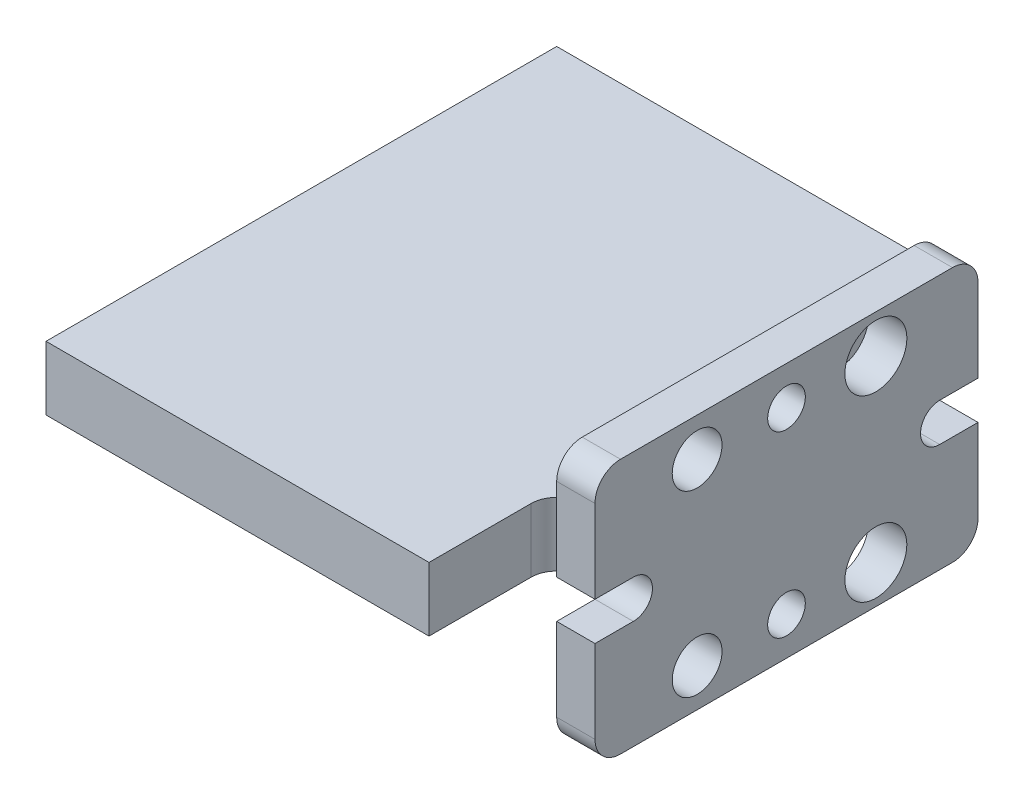
ISO-10303-21;
HEADER;
FILE_DESCRIPTION(('STEP AP214'),'2;1');
FILE_NAME('part.step','',(''),(''),'','','');
FILE_SCHEMA(('AUTOMOTIVE_DESIGN { 1 0 10303 214 1 1 1 1 }'));
ENDSEC;
DATA;
#1=APPLICATION_CONTEXT('core data for automotive mechanical design processes');
#2=APPLICATION_PROTOCOL_DEFINITION('international standard','automotive_design',2000,#1);
#3=PRODUCT_CONTEXT('',#1,'mechanical');
#4=PRODUCT('Part','Part','',(#3));
#5=PRODUCT_RELATED_PRODUCT_CATEGORY('part','',(#4));
#6=PRODUCT_DEFINITION_FORMATION('','',#4);
#7=PRODUCT_DEFINITION_CONTEXT('part definition',#1,'design');
#8=PRODUCT_DEFINITION('design','',#6,#7);
#9=PRODUCT_DEFINITION_SHAPE('','',#8);
#10=(LENGTH_UNIT() NAMED_UNIT(*) SI_UNIT(.MILLI.,.METRE.));
#11=(NAMED_UNIT(*) PLANE_ANGLE_UNIT() SI_UNIT($,.RADIAN.));
#12=(NAMED_UNIT(*) SI_UNIT($,.STERADIAN.) SOLID_ANGLE_UNIT());
#13=UNCERTAINTY_MEASURE_WITH_UNIT(LENGTH_MEASURE(1.E-05),#10,'distance_accuracy_value','');
#14=(GEOMETRIC_REPRESENTATION_CONTEXT(3) GLOBAL_UNCERTAINTY_ASSIGNED_CONTEXT((#13)) GLOBAL_UNIT_ASSIGNED_CONTEXT((#10,
#11,#12)) REPRESENTATION_CONTEXT('',''));
#15=CARTESIAN_POINT('',(0.,0.,0.));
#16=DIRECTION('',(0.,0.,1.));
#17=DIRECTION('',(1.,0.,0.));
#18=AXIS2_PLACEMENT_3D('',#15,#16,#17);
#19=CARTESIAN_POINT('',(3.,0.,0.));
#20=DIRECTION('',(1.,0.,0.));
#21=DIRECTION('',(0.,0.,-1.));
#22=AXIS2_PLACEMENT_3D('',#19,#20,#21);
#23=PLANE('',#22);
#24=CARTESIAN_POINT('',(3.,-7.,7.));
#25=DIRECTION('',(1.,0.,0.));
#26=DIRECTION('',(0.,0.,-1.));
#27=AXIS2_PLACEMENT_3D('',#24,#25,#26);
#28=CIRCLE('',#27,1.95);
#29=CARTESIAN_POINT('',(3.,-7.,5.05));
#30=VERTEX_POINT('',#29);
#31=EDGE_CURVE('E807',#30,#30,#28,.T.);
#32=ORIENTED_EDGE('',*,*,#31,.F.);
#33=EDGE_LOOP('',(#32));
#34=FACE_BOUND('',#33,.T.);
#35=CARTESIAN_POINT('',(3.,-7.,-7.));
#36=DIRECTION('',(1.,0.,0.));
#37=DIRECTION('',(0.,0.,-1.));
#38=AXIS2_PLACEMENT_3D('',#35,#36,#37);
#39=CIRCLE('',#38,2.425);
#40=CARTESIAN_POINT('',(3.,-7.,-9.425));
#41=VERTEX_POINT('',#40);
#42=EDGE_CURVE('E811',#41,#41,#39,.T.);
#43=ORIENTED_EDGE('',*,*,#42,.F.);
#44=EDGE_LOOP('',(#43));
#45=FACE_BOUND('',#44,.T.);
#46=CARTESIAN_POINT('',(3.,7.,-7.));
#47=DIRECTION('',(1.,0.,0.));
#48=DIRECTION('',(0.,0.,1.));
#49=AXIS2_PLACEMENT_3D('',#46,#47,#48);
#50=CIRCLE('',#49,2.425);
#51=CARTESIAN_POINT('',(3.,7.,-4.575));
#52=VERTEX_POINT('',#51);
#53=EDGE_CURVE('E821',#52,#52,#50,.T.);
#54=ORIENTED_EDGE('',*,*,#53,.F.);
#55=EDGE_LOOP('',(#54));
#56=FACE_BOUND('',#55,.T.);
#57=CARTESIAN_POINT('',(3.,7.,0.));
#58=DIRECTION('',(1.,0.,0.));
#59=DIRECTION('',(0.,0.,1.));
#60=AXIS2_PLACEMENT_3D('',#57,#58,#59);
#61=CIRCLE('',#60,1.475);
#62=CARTESIAN_POINT('',(3.,7.,1.475));
#63=VERTEX_POINT('',#62);
#64=EDGE_CURVE('E827',#63,#63,#61,.T.);
#65=ORIENTED_EDGE('',*,*,#64,.F.);
#66=EDGE_LOOP('',(#65));
#67=FACE_BOUND('',#66,.T.);
#68=CARTESIAN_POINT('',(3.,7.,7.));
#69=DIRECTION('',(1.,0.,0.));
#70=DIRECTION('',(0.,0.,1.));
#71=AXIS2_PLACEMENT_3D('',#68,#69,#70);
#72=CIRCLE('',#71,1.95);
#73=CARTESIAN_POINT('',(3.,7.,8.95));
#74=VERTEX_POINT('',#73);
#75=EDGE_CURVE('E833',#74,#74,#72,.T.);
#76=ORIENTED_EDGE('',*,*,#75,.F.);
#77=EDGE_LOOP('',(#76));
#78=FACE_BOUND('',#77,.T.);
#79=CARTESIAN_POINT('',(3.,-7.,0.));
#80=DIRECTION('',(1.,0.,0.));
#81=DIRECTION('',(0.,0.,-1.));
#82=AXIS2_PLACEMENT_3D('',#79,#80,#81);
#83=CIRCLE('',#82,1.475);
#84=CARTESIAN_POINT('',(3.,-7.,-1.475));
#85=VERTEX_POINT('',#84);
#86=EDGE_CURVE('E239',#85,#85,#83,.T.);
#87=ORIENTED_EDGE('',*,*,#86,.F.);
#88=EDGE_LOOP('',(#87));
#89=FACE_BOUND('',#88,.T.);
#90=DIRECTION('',(0.,1.,0.));
#91=VECTOR('',#90,1.);
#92=CARTESIAN_POINT('',(3.,10.,-15.));
#93=LINE('',#92,#91);
#94=CARTESIAN_POINT('',(3.,-8.,-15.));
#95=VERTEX_POINT('',#94);
#96=CARTESIAN_POINT('',(3.,-1.5,-15.));
#97=VERTEX_POINT('',#96);
#98=EDGE_CURVE('E231',#95,#97,#93,.T.);
#99=ORIENTED_EDGE('',*,*,#98,.T.);
#100=DIRECTION('',(0.,0.,-1.));
#101=VECTOR('',#100,1.);
#102=CARTESIAN_POINT('',(3.,-1.5,-12.));
#103=LINE('',#102,#101);
#104=CARTESIAN_POINT('',(3.,-1.5,-12.));
#105=VERTEX_POINT('',#104);
#106=EDGE_CURVE('E219',#105,#97,#103,.T.);
#107=ORIENTED_EDGE('',*,*,#106,.F.);
#108=CARTESIAN_POINT('',(3.,0.,-12.));
#109=DIRECTION('',(1.,0.,0.));
#110=DIRECTION('',(0.,0.,1.));
#111=AXIS2_PLACEMENT_3D('',#108,#109,#110);
#112=CIRCLE('',#111,1.5);
#113=CARTESIAN_POINT('',(3.,1.5,-12.));
#114=VERTEX_POINT('',#113);
#115=EDGE_CURVE('E209',#114,#105,#112,.T.);
#116=ORIENTED_EDGE('',*,*,#115,.F.);
#117=DIRECTION('',(0.,0.,1.));
#118=VECTOR('',#117,1.);
#119=CARTESIAN_POINT('',(3.,1.5,-12.));
#120=LINE('',#119,#118);
#121=CARTESIAN_POINT('',(3.,1.5,-15.));
#122=VERTEX_POINT('',#121);
#123=EDGE_CURVE('E232',#122,#114,#120,.T.);
#124=ORIENTED_EDGE('',*,*,#123,.F.);
#125=CARTESIAN_POINT('',(3.,8.,-15.));
#126=VERTEX_POINT('',#125);
#127=EDGE_CURVE('E300',#122,#126,#93,.T.);
#128=ORIENTED_EDGE('',*,*,#127,.T.);
#129=CARTESIAN_POINT('',(3.,8.,-13.));
#130=DIRECTION('',(1.,0.,0.));
#131=DIRECTION('',(0.,0.,-1.));
#132=AXIS2_PLACEMENT_3D('',#129,#130,#131);
#133=CIRCLE('',#132,2.);
#134=CARTESIAN_POINT('',(3.,10.,-13.));
#135=VERTEX_POINT('',#134);
#136=EDGE_CURVE('E354',#126,#135,#133,.T.);
#137=ORIENTED_EDGE('',*,*,#136,.T.);
#138=DIRECTION('',(0.,0.,1.));
#139=VECTOR('',#138,1.);
#140=CARTESIAN_POINT('',(3.,10.,15.));
#141=LINE('',#140,#139);
#142=CARTESIAN_POINT('',(3.,10.,13.));
#143=VERTEX_POINT('',#142);
#144=EDGE_CURVE('E299',#135,#143,#141,.T.);
#145=ORIENTED_EDGE('',*,*,#144,.T.);
#146=CARTESIAN_POINT('',(3.,8.,13.));
#147=DIRECTION('',(1.,0.,0.));
#148=DIRECTION('',(0.,0.,-1.));
#149=AXIS2_PLACEMENT_3D('',#146,#147,#148);
#150=CIRCLE('',#149,2.);
#151=CARTESIAN_POINT('',(3.,8.,15.));
#152=VERTEX_POINT('',#151);
#153=EDGE_CURVE('E362',#143,#152,#150,.T.);
#154=ORIENTED_EDGE('',*,*,#153,.T.);
#155=DIRECTION('',(0.,-1.,0.));
#156=VECTOR('',#155,1.);
#157=CARTESIAN_POINT('',(3.,10.,15.));
#158=LINE('',#157,#156);
#159=CARTESIAN_POINT('',(3.,1.5,15.));
#160=VERTEX_POINT('',#159);
#161=EDGE_CURVE('E304',#152,#160,#158,.T.);
#162=ORIENTED_EDGE('',*,*,#161,.T.);
#163=DIRECTION('',(0.,0.,1.));
#164=VECTOR('',#163,1.);
#165=CARTESIAN_POINT('',(3.,1.5,12.));
#166=LINE('',#165,#164);
#167=CARTESIAN_POINT('',(3.,1.5,12.));
#168=VERTEX_POINT('',#167);
#169=EDGE_CURVE('E251',#168,#160,#166,.T.);
#170=ORIENTED_EDGE('',*,*,#169,.F.);
#171=CARTESIAN_POINT('',(3.,0.,12.));
#172=DIRECTION('',(1.,0.,0.));
#173=DIRECTION('',(0.,0.,-1.));
#174=AXIS2_PLACEMENT_3D('',#171,#172,#173);
#175=CIRCLE('',#174,1.5);
#176=CARTESIAN_POINT('',(3.,-1.5,12.));
#177=VERTEX_POINT('',#176);
#178=EDGE_CURVE('E248',#177,#168,#175,.T.);
#179=ORIENTED_EDGE('',*,*,#178,.F.);
#180=DIRECTION('',(0.,0.,-1.));
#181=VECTOR('',#180,1.);
#182=CARTESIAN_POINT('',(3.,-1.5,12.));
#183=LINE('',#182,#181);
#184=CARTESIAN_POINT('',(3.,-1.5,15.));
#185=VERTEX_POINT('',#184);
#186=EDGE_CURVE('E246',#185,#177,#183,.T.);
#187=ORIENTED_EDGE('',*,*,#186,.F.);
#188=CARTESIAN_POINT('',(3.,-8.,15.));
#189=VERTEX_POINT('',#188);
#190=EDGE_CURVE('E303',#185,#189,#158,.T.);
#191=ORIENTED_EDGE('',*,*,#190,.T.);
#192=CARTESIAN_POINT('',(3.,-8.,13.));
#193=DIRECTION('',(1.,0.,0.));
#194=DIRECTION('',(0.,0.,-1.));
#195=AXIS2_PLACEMENT_3D('',#192,#193,#194);
#196=CIRCLE('',#195,2.);
#197=CARTESIAN_POINT('',(3.,-10.,13.));
#198=VERTEX_POINT('',#197);
#199=EDGE_CURVE('E386',#189,#198,#196,.T.);
#200=ORIENTED_EDGE('',*,*,#199,.T.);
#201=DIRECTION('',(0.,0.,-1.));
#202=VECTOR('',#201,1.);
#203=CARTESIAN_POINT('',(3.,-10.,15.));
#204=LINE('',#203,#202);
#205=CARTESIAN_POINT('',(3.,-10.,-13.));
#206=VERTEX_POINT('',#205);
#207=EDGE_CURVE('E307',#198,#206,#204,.T.);
#208=ORIENTED_EDGE('',*,*,#207,.T.);
#209=CARTESIAN_POINT('',(3.,-8.,-13.));
#210=DIRECTION('',(1.,0.,0.));
#211=DIRECTION('',(0.,0.,-1.));
#212=AXIS2_PLACEMENT_3D('',#209,#210,#211);
#213=CIRCLE('',#212,2.);
#214=EDGE_CURVE('E375',#206,#95,#213,.T.);
#215=ORIENTED_EDGE('',*,*,#214,.T.);
#216=EDGE_LOOP('',(#99,#107,#116,#124,#128,#137,#145,#154,#162,#170,#179,#187,#191,#200,#208,#215));
#217=FACE_BOUND('',#216,.T.);
#218=ADVANCED_FACE('F35',(#34,#45,#56,#67,#78,#89,#217),#23,.T.);
#219=CARTESIAN_POINT('',(0.,0.,0.));
#220=DIRECTION('',(1.,0.,0.));
#221=DIRECTION('',(0.,0.,-1.));
#222=AXIS2_PLACEMENT_3D('',#219,#220,#221);
#223=PLANE('',#222);
#224=CARTESIAN_POINT('',(0.,-7.,7.));
#225=DIRECTION('',(1.,0.,0.));
#226=DIRECTION('',(0.,0.,-1.));
#227=AXIS2_PLACEMENT_3D('',#224,#225,#226);
#228=CIRCLE('',#227,1.95);
#229=CARTESIAN_POINT('',(0.,-7.,5.05));
#230=VERTEX_POINT('',#229);
#231=EDGE_CURVE('E810',#230,#230,#228,.T.);
#232=ORIENTED_EDGE('',*,*,#231,.T.);
#233=EDGE_LOOP('',(#232));
#234=FACE_BOUND('',#233,.T.);
#235=CARTESIAN_POINT('',(0.,-7.,-7.));
#236=DIRECTION('',(1.,0.,0.));
#237=DIRECTION('',(0.,0.,-1.));
#238=AXIS2_PLACEMENT_3D('',#235,#236,#237);
#239=CIRCLE('',#238,2.425);
#240=CARTESIAN_POINT('',(0.,-7.,-9.425));
#241=VERTEX_POINT('',#240);
#242=EDGE_CURVE('E816',#241,#241,#239,.T.);
#243=ORIENTED_EDGE('',*,*,#242,.T.);
#244=EDGE_LOOP('',(#243));
#245=FACE_BOUND('',#244,.T.);
#246=CARTESIAN_POINT('',(0.,7.,-7.));
#247=DIRECTION('',(1.,0.,0.));
#248=DIRECTION('',(0.,0.,1.));
#249=AXIS2_PLACEMENT_3D('',#246,#247,#248);
#250=CIRCLE('',#249,2.425);
#251=CARTESIAN_POINT('',(0.,7.,-4.575));
#252=VERTEX_POINT('',#251);
#253=EDGE_CURVE('E824',#252,#252,#250,.T.);
#254=ORIENTED_EDGE('',*,*,#253,.T.);
#255=EDGE_LOOP('',(#254));
#256=FACE_BOUND('',#255,.T.);
#257=CARTESIAN_POINT('',(0.,7.,0.));
#258=DIRECTION('',(1.,0.,0.));
#259=DIRECTION('',(0.,0.,1.));
#260=AXIS2_PLACEMENT_3D('',#257,#258,#259);
#261=CIRCLE('',#260,1.475);
#262=CARTESIAN_POINT('',(0.,7.,1.475));
#263=VERTEX_POINT('',#262);
#264=EDGE_CURVE('E830',#263,#263,#261,.T.);
#265=ORIENTED_EDGE('',*,*,#264,.T.);
#266=EDGE_LOOP('',(#265));
#267=FACE_BOUND('',#266,.T.);
#268=CARTESIAN_POINT('',(0.,7.,7.));
#269=DIRECTION('',(1.,0.,0.));
#270=DIRECTION('',(0.,0.,1.));
#271=AXIS2_PLACEMENT_3D('',#268,#269,#270);
#272=CIRCLE('',#271,1.95);
#273=CARTESIAN_POINT('',(0.,7.,8.95));
#274=VERTEX_POINT('',#273);
#275=EDGE_CURVE('E836',#274,#274,#272,.T.);
#276=ORIENTED_EDGE('',*,*,#275,.T.);
#277=EDGE_LOOP('',(#276));
#278=FACE_BOUND('',#277,.T.);
#279=CARTESIAN_POINT('',(0.,-7.,0.));
#280=DIRECTION('',(1.,0.,0.));
#281=DIRECTION('',(0.,0.,-1.));
#282=AXIS2_PLACEMENT_3D('',#279,#280,#281);
#283=CIRCLE('',#282,1.475);
#284=CARTESIAN_POINT('',(0.,-7.,-1.475));
#285=VERTEX_POINT('',#284);
#286=EDGE_CURVE('E813',#285,#285,#283,.T.);
#287=ORIENTED_EDGE('',*,*,#286,.T.);
#288=EDGE_LOOP('',(#287));
#289=FACE_BOUND('',#288,.T.);
#290=DIRECTION('',(0.,1.,0.));
#291=VECTOR('',#290,1.);
#292=CARTESIAN_POINT('',(0.,2.5,-10.));
#293=LINE('',#292,#291);
#294=CARTESIAN_POINT('',(0.,-2.5,-10.));
#295=VERTEX_POINT('',#294);
#296=CARTESIAN_POINT('',(0.,2.5,-10.));
#297=VERTEX_POINT('',#296);
#298=EDGE_CURVE('E309',#295,#297,#293,.T.);
#299=ORIENTED_EDGE('',*,*,#298,.T.);
#300=DIRECTION('',(0.,0.,1.));
#301=VECTOR('',#300,1.);
#302=CARTESIAN_POINT('',(0.,2.5,10.));
#303=LINE('',#302,#301);
#304=CARTESIAN_POINT('',(0.,2.5,10.));
#305=VERTEX_POINT('',#304);
#306=EDGE_CURVE('E330',#297,#305,#303,.T.);
#307=ORIENTED_EDGE('',*,*,#306,.T.);
#308=DIRECTION('',(0.,-1.,0.));
#309=VECTOR('',#308,1.);
#310=CARTESIAN_POINT('',(0.,2.5,10.));
#311=LINE('',#310,#309);
#312=CARTESIAN_POINT('',(0.,-2.5,10.));
#313=VERTEX_POINT('',#312);
#314=EDGE_CURVE('E333',#305,#313,#311,.T.);
#315=ORIENTED_EDGE('',*,*,#314,.T.);
#316=DIRECTION('',(0.,0.,-1.));
#317=VECTOR('',#316,1.);
#318=CARTESIAN_POINT('',(0.,-2.5,10.));
#319=LINE('',#318,#317);
#320=EDGE_CURVE('E325',#313,#295,#319,.T.);
#321=ORIENTED_EDGE('',*,*,#320,.T.);
#322=EDGE_LOOP('',(#299,#307,#315,#321));
#323=FACE_BOUND('',#322,.T.);
#324=DIRECTION('',(0.,0.,-1.));
#325=VECTOR('',#324,1.);
#326=CARTESIAN_POINT('',(0.,-1.5,-12.));
#327=LINE('',#326,#325);
#328=CARTESIAN_POINT('',(0.,-1.5,-12.));
#329=VERTEX_POINT('',#328);
#330=CARTESIAN_POINT('',(0.,-1.5,-15.));
#331=VERTEX_POINT('',#330);
#332=EDGE_CURVE('E225',#329,#331,#327,.T.);
#333=ORIENTED_EDGE('',*,*,#332,.T.);
#334=DIRECTION('',(0.,1.,0.));
#335=VECTOR('',#334,1.);
#336=CARTESIAN_POINT('',(0.,10.,-15.));
#337=LINE('',#336,#335);
#338=CARTESIAN_POINT('',(0.,-8.,-15.));
#339=VERTEX_POINT('',#338);
#340=EDGE_CURVE('E310',#339,#331,#337,.T.);
#341=ORIENTED_EDGE('',*,*,#340,.F.);
#342=CARTESIAN_POINT('',(0.,-8.,-13.));
#343=DIRECTION('',(1.,0.,0.));
#344=DIRECTION('',(0.,0.,-1.));
#345=AXIS2_PLACEMENT_3D('',#342,#343,#344);
#346=CIRCLE('',#345,2.);
#347=CARTESIAN_POINT('',(0.,-10.,-13.));
#348=VERTEX_POINT('',#347);
#349=EDGE_CURVE('E372',#339,#348,#346,.F.);
#350=ORIENTED_EDGE('',*,*,#349,.T.);
#351=DIRECTION('',(0.,0.,-1.));
#352=VECTOR('',#351,1.);
#353=CARTESIAN_POINT('',(0.,-10.,15.));
#354=LINE('',#353,#352);
#355=CARTESIAN_POINT('',(0.,-10.,13.));
#356=VERTEX_POINT('',#355);
#357=EDGE_CURVE('E320',#356,#348,#354,.T.);
#358=ORIENTED_EDGE('',*,*,#357,.F.);
#359=CARTESIAN_POINT('',(0.,-8.,13.));
#360=DIRECTION('',(1.,0.,0.));
#361=DIRECTION('',(0.,0.,-1.));
#362=AXIS2_PLACEMENT_3D('',#359,#360,#361);
#363=CIRCLE('',#362,2.);
#364=CARTESIAN_POINT('',(0.,-8.,15.));
#365=VERTEX_POINT('',#364);
#366=EDGE_CURVE('E383',#356,#365,#363,.F.);
#367=ORIENTED_EDGE('',*,*,#366,.T.);
#368=DIRECTION('',(0.,-1.,0.));
#369=VECTOR('',#368,1.);
#370=CARTESIAN_POINT('',(0.,10.,15.));
#371=LINE('',#370,#369);
#372=CARTESIAN_POINT('',(0.,-1.5,15.));
#373=VERTEX_POINT('',#372);
#374=EDGE_CURVE('E316',#373,#365,#371,.T.);
#375=ORIENTED_EDGE('',*,*,#374,.F.);
#376=DIRECTION('',(0.,0.,-1.));
#377=VECTOR('',#376,1.);
#378=CARTESIAN_POINT('',(0.,-1.5,12.));
#379=LINE('',#378,#377);
#380=CARTESIAN_POINT('',(0.,-1.5,12.));
#381=VERTEX_POINT('',#380);
#382=EDGE_CURVE('E226',#373,#381,#379,.T.);
#383=ORIENTED_EDGE('',*,*,#382,.T.);
#384=CARTESIAN_POINT('',(0.,0.,12.));
#385=DIRECTION('',(1.,0.,0.));
#386=DIRECTION('',(0.,0.,-1.));
#387=AXIS2_PLACEMENT_3D('',#384,#385,#386);
#388=CIRCLE('',#387,1.5);
#389=CARTESIAN_POINT('',(0.,1.5,12.));
#390=VERTEX_POINT('',#389);
#391=EDGE_CURVE('E255',#381,#390,#388,.T.);
#392=ORIENTED_EDGE('',*,*,#391,.T.);
#393=DIRECTION('',(0.,0.,1.));
#394=VECTOR('',#393,1.);
#395=CARTESIAN_POINT('',(0.,1.5,12.));
#396=LINE('',#395,#394);
#397=CARTESIAN_POINT('',(0.,1.5,15.));
#398=VERTEX_POINT('',#397);
#399=EDGE_CURVE('E249',#390,#398,#396,.T.);
#400=ORIENTED_EDGE('',*,*,#399,.T.);
#401=CARTESIAN_POINT('',(0.,8.,15.));
#402=VERTEX_POINT('',#401);
#403=EDGE_CURVE('E317',#402,#398,#371,.T.);
#404=ORIENTED_EDGE('',*,*,#403,.F.);
#405=CARTESIAN_POINT('',(0.,8.,13.));
#406=DIRECTION('',(1.,0.,0.));
#407=DIRECTION('',(0.,0.,-1.));
#408=AXIS2_PLACEMENT_3D('',#405,#406,#407);
#409=CIRCLE('',#408,2.);
#410=CARTESIAN_POINT('',(0.,10.,13.));
#411=VERTEX_POINT('',#410);
#412=EDGE_CURVE('E364',#402,#411,#409,.F.);
#413=ORIENTED_EDGE('',*,*,#412,.T.);
#414=DIRECTION('',(0.,0.,1.));
#415=VECTOR('',#414,1.);
#416=CARTESIAN_POINT('',(0.,10.,15.));
#417=LINE('',#416,#415);
#418=CARTESIAN_POINT('',(0.,10.,-13.));
#419=VERTEX_POINT('',#418);
#420=EDGE_CURVE('E313',#419,#411,#417,.T.);
#421=ORIENTED_EDGE('',*,*,#420,.F.);
#422=CARTESIAN_POINT('',(0.,8.,-13.));
#423=DIRECTION('',(1.,0.,0.));
#424=DIRECTION('',(0.,0.,-1.));
#425=AXIS2_PLACEMENT_3D('',#422,#423,#424);
#426=CIRCLE('',#425,2.);
#427=CARTESIAN_POINT('',(0.,8.,-15.));
#428=VERTEX_POINT('',#427);
#429=EDGE_CURVE('E351',#419,#428,#426,.F.);
#430=ORIENTED_EDGE('',*,*,#429,.T.);
#431=CARTESIAN_POINT('',(0.,1.5,-15.));
#432=VERTEX_POINT('',#431);
#433=EDGE_CURVE('E297',#432,#428,#337,.T.);
#434=ORIENTED_EDGE('',*,*,#433,.F.);
#435=DIRECTION('',(0.,0.,1.));
#436=VECTOR('',#435,1.);
#437=CARTESIAN_POINT('',(0.,1.5,-12.));
#438=LINE('',#437,#436);
#439=CARTESIAN_POINT('',(0.,1.5,-12.));
#440=VERTEX_POINT('',#439);
#441=EDGE_CURVE('E50',#432,#440,#438,.T.);
#442=ORIENTED_EDGE('',*,*,#441,.T.);
#443=CARTESIAN_POINT('',(0.,0.,-12.));
#444=DIRECTION('',(1.,0.,0.));
#445=DIRECTION('',(0.,0.,1.));
#446=AXIS2_PLACEMENT_3D('',#443,#444,#445);
#447=CIRCLE('',#446,1.5);
#448=EDGE_CURVE('E237',#440,#329,#447,.T.);
#449=ORIENTED_EDGE('',*,*,#448,.T.);
#450=EDGE_LOOP('',(#333,#341,#350,#358,#367,#375,#383,#392,#400,#404,#413,#421,#430,#434,#442,#449));
#451=FACE_BOUND('',#450,.T.);
#452=ADVANCED_FACE('F430',(#234,#245,#256,#267,#278,#289,#323,#451),#223,.F.);
#453=CARTESIAN_POINT('',(3.,10.,-15.));
#454=DIRECTION('',(0.,0.,1.));
#455=DIRECTION('',(1.,0.,0.));
#456=AXIS2_PLACEMENT_3D('',#453,#454,#455);
#457=PLANE('',#456);
#458=DIRECTION('',(-1.,0.,0.));
#459=VECTOR('',#458,1.);
#460=CARTESIAN_POINT('',(3.,-1.5,-15.));
#461=LINE('',#460,#459);
#462=EDGE_CURVE('E227',#97,#331,#461,.T.);
#463=ORIENTED_EDGE('',*,*,#462,.F.);
#464=ORIENTED_EDGE('',*,*,#98,.F.);
#465=DIRECTION('',(1.,0.,0.));
#466=VECTOR('',#465,1.);
#467=CARTESIAN_POINT('',(3.,-8.,-15.));
#468=LINE('',#467,#466);
#469=EDGE_CURVE('E369',#95,#339,#468,.F.);
#470=ORIENTED_EDGE('',*,*,#469,.T.);
#471=ORIENTED_EDGE('',*,*,#340,.T.);
#472=EDGE_LOOP('',(#463,#464,#470,#471));
#473=FACE_BOUND('',#472,.T.);
#474=ADVANCED_FACE('F471',(#473),#457,.F.);
#475=DIRECTION('',(-1.,0.,0.));
#476=VECTOR('',#475,1.);
#477=CARTESIAN_POINT('',(3.,1.5,-15.));
#478=LINE('',#477,#476);
#479=EDGE_CURVE('E243',#122,#432,#478,.T.);
#480=ORIENTED_EDGE('',*,*,#479,.T.);
#481=ORIENTED_EDGE('',*,*,#433,.T.);
#482=DIRECTION('',(1.,0.,0.));
#483=VECTOR('',#482,1.);
#484=CARTESIAN_POINT('',(3.,8.,-15.));
#485=LINE('',#484,#483);
#486=EDGE_CURVE('E340',#428,#126,#485,.T.);
#487=ORIENTED_EDGE('',*,*,#486,.T.);
#488=ORIENTED_EDGE('',*,*,#127,.F.);
#489=EDGE_LOOP('',(#480,#481,#487,#488));
#490=FACE_BOUND('',#489,.T.);
#491=ADVANCED_FACE('F485',(#490),#457,.F.);
#492=CARTESIAN_POINT('',(3.,10.,15.));
#493=DIRECTION('',(0.,0.,-1.));
#494=DIRECTION('',(0.,1.,0.));
#495=AXIS2_PLACEMENT_3D('',#492,#493,#494);
#496=PLANE('',#495);
#497=DIRECTION('',(-1.,0.,0.));
#498=VECTOR('',#497,1.);
#499=CARTESIAN_POINT('',(3.,-1.5,15.));
#500=LINE('',#499,#498);
#501=EDGE_CURVE('E264',#185,#373,#500,.T.);
#502=ORIENTED_EDGE('',*,*,#501,.T.);
#503=ORIENTED_EDGE('',*,*,#374,.T.);
#504=DIRECTION('',(1.,0.,0.));
#505=VECTOR('',#504,1.);
#506=CARTESIAN_POINT('',(3.,-8.,15.));
#507=LINE('',#506,#505);
#508=EDGE_CURVE('E377',#365,#189,#507,.T.);
#509=ORIENTED_EDGE('',*,*,#508,.T.);
#510=ORIENTED_EDGE('',*,*,#190,.F.);
#511=EDGE_LOOP('',(#502,#503,#509,#510));
#512=FACE_BOUND('',#511,.T.);
#513=ADVANCED_FACE('F482',(#512),#496,.F.);
#514=DIRECTION('',(-1.,0.,0.));
#515=VECTOR('',#514,1.);
#516=CARTESIAN_POINT('',(3.,1.5,15.));
#517=LINE('',#516,#515);
#518=EDGE_CURVE('E58',#160,#398,#517,.T.);
#519=ORIENTED_EDGE('',*,*,#518,.F.);
#520=ORIENTED_EDGE('',*,*,#161,.F.);
#521=DIRECTION('',(-1.,0.,0.));
#522=VECTOR('',#521,1.);
#523=CARTESIAN_POINT('',(3.,8.,15.));
#524=LINE('',#523,#522);
#525=EDGE_CURVE('E356',#152,#402,#524,.T.);
#526=ORIENTED_EDGE('',*,*,#525,.T.);
#527=ORIENTED_EDGE('',*,*,#403,.T.);
#528=EDGE_LOOP('',(#519,#520,#526,#527));
#529=FACE_BOUND('',#528,.T.);
#530=ADVANCED_FACE('F484',(#529),#496,.F.);
#531=CARTESIAN_POINT('',(-3.,2.5,12.));
#532=DIRECTION('',(0.,-1.,0.));
#533=DIRECTION('',(0.,0.,-1.));
#534=AXIS2_PLACEMENT_3D('',#531,#532,#533);
#535=CYLINDRICAL_SURFACE('',#534,2.);
#536=DIRECTION('',(0.,-1.,0.));
#537=VECTOR('',#536,1.);
#538=CARTESIAN_POINT('',(-3.,2.5,10.));
#539=LINE('',#538,#537);
#540=CARTESIAN_POINT('',(-3.,2.5,10.));
#541=VERTEX_POINT('',#540);
#542=CARTESIAN_POINT('',(-3.,-2.5,10.));
#543=VERTEX_POINT('',#542);
#544=EDGE_CURVE('E398',#541,#543,#539,.T.);
#545=ORIENTED_EDGE('',*,*,#544,.F.);
#546=CARTESIAN_POINT('',(-3.,2.5,12.));
#547=DIRECTION('',(0.,1.,0.));
#548=DIRECTION('',(0.,0.,1.));
#549=AXIS2_PLACEMENT_3D('',#546,#547,#548);
#550=CIRCLE('',#549,2.);
#551=CARTESIAN_POINT('',(-5.,2.5,12.));
#552=VERTEX_POINT('',#551);
#553=EDGE_CURVE('E43',#541,#552,#550,.T.);
#554=ORIENTED_EDGE('',*,*,#553,.T.);
#555=DIRECTION('',(0.,-1.,0.));
#556=VECTOR('',#555,1.);
#557=CARTESIAN_POINT('',(-5.,2.5,12.));
#558=LINE('',#557,#556);
#559=CARTESIAN_POINT('',(-5.,-2.5,12.));
#560=VERTEX_POINT('',#559);
#561=EDGE_CURVE('E401',#560,#552,#558,.F.);
#562=ORIENTED_EDGE('',*,*,#561,.F.);
#563=CARTESIAN_POINT('',(-3.,-2.5,12.));
#564=DIRECTION('',(0.,-1.,0.));
#565=DIRECTION('',(0.,0.,-1.));
#566=AXIS2_PLACEMENT_3D('',#563,#564,#565);
#567=CIRCLE('',#566,2.);
#568=EDGE_CURVE('E11',#560,#543,#567,.T.);
#569=ORIENTED_EDGE('',*,*,#568,.T.);
#570=EDGE_LOOP('',(#545,#554,#562,#569));
#571=FACE_BOUND('',#570,.T.);
#572=ADVANCED_FACE('F37',(#571),#535,.F.);
#573=CARTESIAN_POINT('',(-3.,2.5,-12.));
#574=DIRECTION('',(0.,-1.,0.));
#575=DIRECTION('',(0.,0.,-1.));
#576=AXIS2_PLACEMENT_3D('',#573,#574,#575);
#577=CYLINDRICAL_SURFACE('',#576,2.);
#578=DIRECTION('',(0.,-1.,0.));
#579=VECTOR('',#578,1.);
#580=CARTESIAN_POINT('',(-5.,2.5,-12.));
#581=LINE('',#580,#579);
#582=CARTESIAN_POINT('',(-5.,2.5,-12.));
#583=VERTEX_POINT('',#582);
#584=CARTESIAN_POINT('',(-5.,-2.5,-12.));
#585=VERTEX_POINT('',#584);
#586=EDGE_CURVE('E388',#583,#585,#581,.T.);
#587=ORIENTED_EDGE('',*,*,#586,.F.);
#588=CARTESIAN_POINT('',(-3.,2.5,-12.));
#589=DIRECTION('',(0.,1.,0.));
#590=DIRECTION('',(0.,0.,1.));
#591=AXIS2_PLACEMENT_3D('',#588,#589,#590);
#592=CIRCLE('',#591,2.);
#593=CARTESIAN_POINT('',(-3.,2.5,-10.));
#594=VERTEX_POINT('',#593);
#595=EDGE_CURVE('E394',#583,#594,#592,.T.);
#596=ORIENTED_EDGE('',*,*,#595,.T.);
#597=DIRECTION('',(0.,-1.,0.));
#598=VECTOR('',#597,1.);
#599=CARTESIAN_POINT('',(-3.,2.5,-10.));
#600=LINE('',#599,#598);
#601=CARTESIAN_POINT('',(-3.,-2.5,-10.));
#602=VERTEX_POINT('',#601);
#603=EDGE_CURVE('E391',#602,#594,#600,.F.);
#604=ORIENTED_EDGE('',*,*,#603,.F.);
#605=CARTESIAN_POINT('',(-3.,-2.5,-12.));
#606=DIRECTION('',(0.,-1.,0.));
#607=DIRECTION('',(0.,0.,-1.));
#608=AXIS2_PLACEMENT_3D('',#605,#606,#607);
#609=CIRCLE('',#608,2.);
#610=EDGE_CURVE('E396',#602,#585,#609,.T.);
#611=ORIENTED_EDGE('',*,*,#610,.T.);
#612=EDGE_LOOP('',(#587,#596,#604,#611));
#613=FACE_BOUND('',#612,.T.);
#614=ADVANCED_FACE('F438',(#613),#577,.F.);
#615=CARTESIAN_POINT('',(-35.,2.5,-10.));
#616=DIRECTION('',(0.,0.,-1.));
#617=DIRECTION('',(-1.,0.,0.));
#618=AXIS2_PLACEMENT_3D('',#615,#616,#617);
#619=PLANE('',#618);
#620=DIRECTION('',(1.,0.,0.));
#621=VECTOR('',#620,1.);
#622=CARTESIAN_POINT('',(-35.,-2.5,-10.));
#623=LINE('',#622,#621);
#624=EDGE_CURVE('E338',#602,#295,#623,.T.);
#625=ORIENTED_EDGE('',*,*,#624,.F.);
#626=ORIENTED_EDGE('',*,*,#603,.T.);
#627=DIRECTION('',(1.,0.,0.));
#628=VECTOR('',#627,1.);
#629=CARTESIAN_POINT('',(-35.,2.5,-10.));
#630=LINE('',#629,#628);
#631=EDGE_CURVE('E327',#594,#297,#630,.T.);
#632=ORIENTED_EDGE('',*,*,#631,.T.);
#633=ORIENTED_EDGE('',*,*,#298,.F.);
#634=EDGE_LOOP('',(#625,#626,#632,#633));
#635=FACE_BOUND('',#634,.T.);
#636=ADVANCED_FACE('F434',(#635),#619,.T.);
#637=CARTESIAN_POINT('',(-35.,2.5,10.));
#638=DIRECTION('',(0.,0.,1.));
#639=DIRECTION('',(1.,0.,0.));
#640=AXIS2_PLACEMENT_3D('',#637,#638,#639);
#641=PLANE('',#640);
#642=DIRECTION('',(1.,0.,0.));
#643=VECTOR('',#642,1.);
#644=CARTESIAN_POINT('',(-35.,2.5,10.));
#645=LINE('',#644,#643);
#646=EDGE_CURVE('E343',#541,#305,#645,.T.);
#647=ORIENTED_EDGE('',*,*,#646,.F.);
#648=ORIENTED_EDGE('',*,*,#544,.T.);
#649=DIRECTION('',(1.,0.,0.));
#650=VECTOR('',#649,1.);
#651=CARTESIAN_POINT('',(-35.,-2.5,10.));
#652=LINE('',#651,#650);
#653=EDGE_CURVE('E341',#543,#313,#652,.T.);
#654=ORIENTED_EDGE('',*,*,#653,.T.);
#655=ORIENTED_EDGE('',*,*,#314,.F.);
#656=EDGE_LOOP('',(#647,#648,#654,#655));
#657=FACE_BOUND('',#656,.T.);
#658=ADVANCED_FACE('F424',(#657),#641,.T.);
#659=CARTESIAN_POINT('',(3.,-8.,13.));
#660=DIRECTION('',(1.,0.,0.));
#661=DIRECTION('',(0.,0.,-1.));
#662=AXIS2_PLACEMENT_3D('',#659,#660,#661);
#663=CYLINDRICAL_SURFACE('',#662,2.);
#664=ORIENTED_EDGE('',*,*,#508,.F.);
#665=ORIENTED_EDGE('',*,*,#366,.F.);
#666=DIRECTION('',(1.,0.,0.));
#667=VECTOR('',#666,1.);
#668=CARTESIAN_POINT('',(3.,-10.,13.));
#669=LINE('',#668,#667);
#670=EDGE_CURVE('E380',#198,#356,#669,.F.);
#671=ORIENTED_EDGE('',*,*,#670,.F.);
#672=ORIENTED_EDGE('',*,*,#199,.F.);
#673=EDGE_LOOP('',(#664,#665,#671,#672));
#674=FACE_BOUND('',#673,.T.);
#675=ADVANCED_FACE('F530',(#674),#663,.T.);
#676=CARTESIAN_POINT('',(3.,-8.,-13.));
#677=DIRECTION('',(1.,0.,0.));
#678=DIRECTION('',(0.,0.,-1.));
#679=AXIS2_PLACEMENT_3D('',#676,#677,#678);
#680=CYLINDRICAL_SURFACE('',#679,2.);
#681=DIRECTION('',(1.,0.,0.));
#682=VECTOR('',#681,1.);
#683=CARTESIAN_POINT('',(3.,-10.,-13.));
#684=LINE('',#683,#682);
#685=EDGE_CURVE('E366',#348,#206,#684,.T.);
#686=ORIENTED_EDGE('',*,*,#685,.F.);
#687=ORIENTED_EDGE('',*,*,#349,.F.);
#688=ORIENTED_EDGE('',*,*,#469,.F.);
#689=ORIENTED_EDGE('',*,*,#214,.F.);
#690=EDGE_LOOP('',(#686,#687,#688,#689));
#691=FACE_BOUND('',#690,.T.);
#692=ADVANCED_FACE('F536',(#691),#680,.T.);
#693=CARTESIAN_POINT('',(3.,8.,13.));
#694=DIRECTION('',(-1.,0.,0.));
#695=DIRECTION('',(0.,0.,1.));
#696=AXIS2_PLACEMENT_3D('',#693,#694,#695);
#697=CYLINDRICAL_SURFACE('',#696,2.);
#698=ORIENTED_EDGE('',*,*,#525,.F.);
#699=ORIENTED_EDGE('',*,*,#153,.F.);
#700=DIRECTION('',(-1.,0.,0.));
#701=VECTOR('',#700,1.);
#702=CARTESIAN_POINT('',(3.,10.,13.));
#703=LINE('',#702,#701);
#704=EDGE_CURVE('E359',#411,#143,#703,.F.);
#705=ORIENTED_EDGE('',*,*,#704,.F.);
#706=ORIENTED_EDGE('',*,*,#412,.F.);
#707=EDGE_LOOP('',(#698,#699,#705,#706));
#708=FACE_BOUND('',#707,.T.);
#709=ADVANCED_FACE('F510',(#708),#697,.T.);
#710=CARTESIAN_POINT('',(3.,8.,-13.));
#711=DIRECTION('',(1.,0.,0.));
#712=DIRECTION('',(0.,0.,-1.));
#713=AXIS2_PLACEMENT_3D('',#710,#711,#712);
#714=CYLINDRICAL_SURFACE('',#713,2.);
#715=ORIENTED_EDGE('',*,*,#486,.F.);
#716=ORIENTED_EDGE('',*,*,#429,.F.);
#717=DIRECTION('',(1.,0.,0.));
#718=VECTOR('',#717,1.);
#719=CARTESIAN_POINT('',(3.,10.,-13.));
#720=LINE('',#719,#718);
#721=EDGE_CURVE('E348',#135,#419,#720,.F.);
#722=ORIENTED_EDGE('',*,*,#721,.F.);
#723=ORIENTED_EDGE('',*,*,#136,.F.);
#724=EDGE_LOOP('',(#715,#716,#722,#723));
#725=FACE_BOUND('',#724,.T.);
#726=ADVANCED_FACE('F503',(#725),#714,.T.);
#727=CARTESIAN_POINT('',(-35.,-2.5,10.));
#728=DIRECTION('',(0.,-1.,0.));
#729=DIRECTION('',(0.,0.,-1.));
#730=AXIS2_PLACEMENT_3D('',#727,#728,#729);
#731=PLANE('',#730);
#732=ORIENTED_EDGE('',*,*,#610,.F.);
#733=ORIENTED_EDGE('',*,*,#624,.T.);
#734=ORIENTED_EDGE('',*,*,#320,.F.);
#735=ORIENTED_EDGE('',*,*,#653,.F.);
#736=ORIENTED_EDGE('',*,*,#568,.F.);
#737=DIRECTION('',(0.,0.,-1.));
#738=VECTOR('',#737,1.);
#739=CARTESIAN_POINT('',(-5.,-2.5,-20.));
#740=LINE('',#739,#738);
#741=CARTESIAN_POINT('',(-5.,-2.5,20.));
#742=VERTEX_POINT('',#741);
#743=EDGE_CURVE('E281',#742,#560,#740,.T.);
#744=ORIENTED_EDGE('',*,*,#743,.F.);
#745=DIRECTION('',(1.,0.,0.));
#746=VECTOR('',#745,1.);
#747=CARTESIAN_POINT('',(-35.,-2.5,20.));
#748=LINE('',#747,#746);
#749=CARTESIAN_POINT('',(-35.,-2.5,20.));
#750=VERTEX_POINT('',#749);
#751=EDGE_CURVE('E267',#750,#742,#748,.T.);
#752=ORIENTED_EDGE('',*,*,#751,.F.);
#753=DIRECTION('',(0.,0.,-1.));
#754=VECTOR('',#753,1.);
#755=CARTESIAN_POINT('',(-35.,-2.5,10.));
#756=LINE('',#755,#754);
#757=CARTESIAN_POINT('',(-35.,-2.5,-20.));
#758=VERTEX_POINT('',#757);
#759=EDGE_CURVE('E324',#750,#758,#756,.T.);
#760=ORIENTED_EDGE('',*,*,#759,.T.);
#761=DIRECTION('',(-1.,0.,0.));
#762=VECTOR('',#761,1.);
#763=CARTESIAN_POINT('',(-35.,-2.5,-20.));
#764=LINE('',#763,#762);
#765=CARTESIAN_POINT('',(-5.,-2.5,-20.));
#766=VERTEX_POINT('',#765);
#767=EDGE_CURVE('E271',#766,#758,#764,.T.);
#768=ORIENTED_EDGE('',*,*,#767,.F.);
#769=EDGE_CURVE('E280',#585,#766,#740,.T.);
#770=ORIENTED_EDGE('',*,*,#769,.F.);
#771=EDGE_LOOP('',(#732,#733,#734,#735,#736,#744,#752,#760,#768,#770));
#772=FACE_BOUND('',#771,.T.);
#773=ADVANCED_FACE('F420',(#772),#731,.T.);
#774=CARTESIAN_POINT('',(-35.,2.5,10.));
#775=DIRECTION('',(0.,1.,0.));
#776=DIRECTION('',(0.,0.,1.));
#777=AXIS2_PLACEMENT_3D('',#774,#775,#776);
#778=PLANE('',#777);
#779=ORIENTED_EDGE('',*,*,#553,.F.);
#780=ORIENTED_EDGE('',*,*,#646,.T.);
#781=ORIENTED_EDGE('',*,*,#306,.F.);
#782=ORIENTED_EDGE('',*,*,#631,.F.);
#783=ORIENTED_EDGE('',*,*,#595,.F.);
#784=DIRECTION('',(0.,0.,-1.));
#785=VECTOR('',#784,1.);
#786=CARTESIAN_POINT('',(-5.,2.5,-20.));
#787=LINE('',#786,#785);
#788=CARTESIAN_POINT('',(-5.,2.5,-20.));
#789=VERTEX_POINT('',#788);
#790=EDGE_CURVE('E270',#583,#789,#787,.T.);
#791=ORIENTED_EDGE('',*,*,#790,.T.);
#792=DIRECTION('',(-1.,0.,0.));
#793=VECTOR('',#792,1.);
#794=CARTESIAN_POINT('',(-35.,2.5,-20.));
#795=LINE('',#794,#793);
#796=CARTESIAN_POINT('',(-35.,2.5,-20.));
#797=VERTEX_POINT('',#796);
#798=EDGE_CURVE('E275',#789,#797,#795,.T.);
#799=ORIENTED_EDGE('',*,*,#798,.T.);
#800=DIRECTION('',(0.,0.,1.));
#801=VECTOR('',#800,1.);
#802=CARTESIAN_POINT('',(-35.,2.5,10.));
#803=LINE('',#802,#801);
#804=CARTESIAN_POINT('',(-35.,2.5,20.));
#805=VERTEX_POINT('',#804);
#806=EDGE_CURVE('E322',#797,#805,#803,.T.);
#807=ORIENTED_EDGE('',*,*,#806,.T.);
#808=DIRECTION('',(1.,0.,0.));
#809=VECTOR('',#808,1.);
#810=CARTESIAN_POINT('',(-35.,2.5,20.));
#811=LINE('',#810,#809);
#812=CARTESIAN_POINT('',(-5.,2.5,20.));
#813=VERTEX_POINT('',#812);
#814=EDGE_CURVE('E268',#805,#813,#811,.T.);
#815=ORIENTED_EDGE('',*,*,#814,.T.);
#816=EDGE_CURVE('E272',#813,#552,#787,.T.);
#817=ORIENTED_EDGE('',*,*,#816,.T.);
#818=EDGE_LOOP('',(#779,#780,#781,#782,#783,#791,#799,#807,#815,#817));
#819=FACE_BOUND('',#818,.T.);
#820=ADVANCED_FACE('F412',(#819),#778,.T.);
#821=CARTESIAN_POINT('',(-35.,0.,0.));
#822=DIRECTION('',(1.,0.,0.));
#823=DIRECTION('',(0.,0.,-1.));
#824=AXIS2_PLACEMENT_3D('',#821,#822,#823);
#825=PLANE('',#824);
#826=ORIENTED_EDGE('',*,*,#806,.F.);
#827=DIRECTION('',(0.,-1.,0.));
#828=VECTOR('',#827,1.);
#829=CARTESIAN_POINT('',(-35.,2.5,-20.));
#830=LINE('',#829,#828);
#831=EDGE_CURVE('E278',#797,#758,#830,.T.);
#832=ORIENTED_EDGE('',*,*,#831,.T.);
#833=ORIENTED_EDGE('',*,*,#759,.F.);
#834=DIRECTION('',(0.,-1.,0.));
#835=VECTOR('',#834,1.);
#836=CARTESIAN_POINT('',(-35.,2.5,20.));
#837=LINE('',#836,#835);
#838=EDGE_CURVE('E294',#805,#750,#837,.T.);
#839=ORIENTED_EDGE('',*,*,#838,.F.);
#840=EDGE_LOOP('',(#826,#832,#833,#839));
#841=FACE_BOUND('',#840,.T.);
#842=ADVANCED_FACE('F450',(#841),#825,.F.);
#843=CARTESIAN_POINT('',(3.,10.,15.));
#844=DIRECTION('',(0.,-1.,0.));
#845=DIRECTION('',(0.,0.,-1.));
#846=AXIS2_PLACEMENT_3D('',#843,#844,#845);
#847=PLANE('',#846);
#848=ORIENTED_EDGE('',*,*,#420,.T.);
#849=ORIENTED_EDGE('',*,*,#704,.T.);
#850=ORIENTED_EDGE('',*,*,#144,.F.);
#851=ORIENTED_EDGE('',*,*,#721,.T.);
#852=EDGE_LOOP('',(#848,#849,#850,#851));
#853=FACE_BOUND('',#852,.T.);
#854=ADVANCED_FACE('F452',(#853),#847,.F.);
#855=CARTESIAN_POINT('',(3.,-10.,15.));
#856=DIRECTION('',(0.,1.,0.));
#857=DIRECTION('',(0.,0.,1.));
#858=AXIS2_PLACEMENT_3D('',#855,#856,#857);
#859=PLANE('',#858);
#860=ORIENTED_EDGE('',*,*,#207,.F.);
#861=ORIENTED_EDGE('',*,*,#670,.T.);
#862=ORIENTED_EDGE('',*,*,#357,.T.);
#863=ORIENTED_EDGE('',*,*,#685,.T.);
#864=EDGE_LOOP('',(#860,#861,#862,#863));
#865=FACE_BOUND('',#864,.T.);
#866=ADVANCED_FACE('F458',(#865),#859,.F.);
#867=CARTESIAN_POINT('',(-35.,2.5,20.));
#868=DIRECTION('',(0.,0.,-1.));
#869=DIRECTION('',(-1.,0.,0.));
#870=AXIS2_PLACEMENT_3D('',#867,#868,#869);
#871=PLANE('',#870);
#872=ORIENTED_EDGE('',*,*,#751,.T.);
#873=DIRECTION('',(0.,-1.,0.));
#874=VECTOR('',#873,1.);
#875=CARTESIAN_POINT('',(-5.,2.5,20.));
#876=LINE('',#875,#874);
#877=EDGE_CURVE('E291',#813,#742,#876,.T.);
#878=ORIENTED_EDGE('',*,*,#877,.F.);
#879=ORIENTED_EDGE('',*,*,#814,.F.);
#880=ORIENTED_EDGE('',*,*,#838,.T.);
#881=EDGE_LOOP('',(#872,#878,#879,#880));
#882=FACE_BOUND('',#881,.T.);
#883=ADVANCED_FACE('F417',(#882),#871,.F.);
#884=CARTESIAN_POINT('',(-5.,2.5,-20.));
#885=DIRECTION('',(-1.,0.,0.));
#886=DIRECTION('',(0.,0.,1.));
#887=AXIS2_PLACEMENT_3D('',#884,#885,#886);
#888=PLANE('',#887);
#889=ORIENTED_EDGE('',*,*,#743,.T.);
#890=ORIENTED_EDGE('',*,*,#561,.T.);
#891=ORIENTED_EDGE('',*,*,#816,.F.);
#892=ORIENTED_EDGE('',*,*,#877,.T.);
#893=EDGE_LOOP('',(#889,#890,#891,#892));
#894=FACE_BOUND('',#893,.T.);
#895=ADVANCED_FACE('F410',(#894),#888,.F.);
#896=ORIENTED_EDGE('',*,*,#790,.F.);
#897=ORIENTED_EDGE('',*,*,#586,.T.);
#898=ORIENTED_EDGE('',*,*,#769,.T.);
#899=DIRECTION('',(0.,-1.,0.));
#900=VECTOR('',#899,1.);
#901=CARTESIAN_POINT('',(-5.,2.5,-20.));
#902=LINE('',#901,#900);
#903=EDGE_CURVE('E288',#789,#766,#902,.T.);
#904=ORIENTED_EDGE('',*,*,#903,.F.);
#905=EDGE_LOOP('',(#896,#897,#898,#904));
#906=FACE_BOUND('',#905,.T.);
#907=ADVANCED_FACE('F444',(#906),#888,.F.);
#908=CARTESIAN_POINT('',(-35.,2.5,-20.));
#909=DIRECTION('',(0.,0.,1.));
#910=DIRECTION('',(1.,0.,0.));
#911=AXIS2_PLACEMENT_3D('',#908,#909,#910);
#912=PLANE('',#911);
#913=ORIENTED_EDGE('',*,*,#767,.T.);
#914=ORIENTED_EDGE('',*,*,#831,.F.);
#915=ORIENTED_EDGE('',*,*,#798,.F.);
#916=ORIENTED_EDGE('',*,*,#903,.T.);
#917=EDGE_LOOP('',(#913,#914,#915,#916));
#918=FACE_BOUND('',#917,.T.);
#919=ADVANCED_FACE('F448',(#918),#912,.F.);
#920=CARTESIAN_POINT('',(3.,-1.5,12.));
#921=DIRECTION('',(0.,1.,0.));
#922=DIRECTION('',(0.,0.,1.));
#923=AXIS2_PLACEMENT_3D('',#920,#921,#922);
#924=PLANE('',#923);
#925=ORIENTED_EDGE('',*,*,#382,.F.);
#926=ORIENTED_EDGE('',*,*,#501,.F.);
#927=ORIENTED_EDGE('',*,*,#186,.T.);
#928=DIRECTION('',(-1.,0.,0.));
#929=VECTOR('',#928,1.);
#930=CARTESIAN_POINT('',(3.,-1.5,12.));
#931=LINE('',#930,#929);
#932=EDGE_CURVE('E262',#177,#381,#931,.T.);
#933=ORIENTED_EDGE('',*,*,#932,.T.);
#934=EDGE_LOOP('',(#925,#926,#927,#933));
#935=FACE_BOUND('',#934,.T.);
#936=ADVANCED_FACE('F523',(#935),#924,.T.);
#937=CARTESIAN_POINT('',(3.,0.,12.));
#938=DIRECTION('',(-1.,0.,0.));
#939=DIRECTION('',(0.,0.,1.));
#940=AXIS2_PLACEMENT_3D('',#937,#938,#939);
#941=CYLINDRICAL_SURFACE('',#940,1.5);
#942=ORIENTED_EDGE('',*,*,#391,.F.);
#943=ORIENTED_EDGE('',*,*,#932,.F.);
#944=ORIENTED_EDGE('',*,*,#178,.T.);
#945=DIRECTION('',(-1.,0.,0.));
#946=VECTOR('',#945,1.);
#947=CARTESIAN_POINT('',(3.,1.5,12.));
#948=LINE('',#947,#946);
#949=EDGE_CURVE('E260',#168,#390,#948,.T.);
#950=ORIENTED_EDGE('',*,*,#949,.T.);
#951=EDGE_LOOP('',(#942,#943,#944,#950));
#952=FACE_BOUND('',#951,.T.);
#953=ADVANCED_FACE('F521',(#952),#941,.F.);
#954=CARTESIAN_POINT('',(3.,1.5,12.));
#955=DIRECTION('',(0.,-1.,0.));
#956=DIRECTION('',(0.,0.,-1.));
#957=AXIS2_PLACEMENT_3D('',#954,#955,#956);
#958=PLANE('',#957);
#959=ORIENTED_EDGE('',*,*,#399,.F.);
#960=ORIENTED_EDGE('',*,*,#949,.F.);
#961=ORIENTED_EDGE('',*,*,#169,.T.);
#962=ORIENTED_EDGE('',*,*,#518,.T.);
#963=EDGE_LOOP('',(#959,#960,#961,#962));
#964=FACE_BOUND('',#963,.T.);
#965=ADVANCED_FACE('F515',(#964),#958,.T.);
#966=CARTESIAN_POINT('',(3.,0.,-12.));
#967=DIRECTION('',(-1.,0.,0.));
#968=DIRECTION('',(0.,0.,1.));
#969=AXIS2_PLACEMENT_3D('',#966,#967,#968);
#970=CYLINDRICAL_SURFACE('',#969,1.5);
#971=ORIENTED_EDGE('',*,*,#448,.F.);
#972=DIRECTION('',(-1.,0.,0.));
#973=VECTOR('',#972,1.);
#974=CARTESIAN_POINT('',(3.,1.5,-12.));
#975=LINE('',#974,#973);
#976=EDGE_CURVE('E215',#114,#440,#975,.T.);
#977=ORIENTED_EDGE('',*,*,#976,.F.);
#978=ORIENTED_EDGE('',*,*,#115,.T.);
#979=DIRECTION('',(-1.,0.,0.));
#980=VECTOR('',#979,1.);
#981=CARTESIAN_POINT('',(3.,-1.5,-12.));
#982=LINE('',#981,#980);
#983=EDGE_CURVE('E213',#105,#329,#982,.T.);
#984=ORIENTED_EDGE('',*,*,#983,.T.);
#985=EDGE_LOOP('',(#971,#977,#978,#984));
#986=FACE_BOUND('',#985,.T.);
#987=ADVANCED_FACE('F212',(#986),#970,.F.);
#988=CARTESIAN_POINT('',(3.,-1.5,-12.));
#989=DIRECTION('',(0.,1.,0.));
#990=DIRECTION('',(0.,0.,1.));
#991=AXIS2_PLACEMENT_3D('',#988,#989,#990);
#992=PLANE('',#991);
#993=ORIENTED_EDGE('',*,*,#332,.F.);
#994=ORIENTED_EDGE('',*,*,#983,.F.);
#995=ORIENTED_EDGE('',*,*,#106,.T.);
#996=ORIENTED_EDGE('',*,*,#462,.T.);
#997=EDGE_LOOP('',(#993,#994,#995,#996));
#998=FACE_BOUND('',#997,.T.);
#999=ADVANCED_FACE('F222',(#998),#992,.T.);
#1000=CARTESIAN_POINT('',(3.,1.5,-12.));
#1001=DIRECTION('',(0.,-1.,0.));
#1002=DIRECTION('',(0.,0.,-1.));
#1003=AXIS2_PLACEMENT_3D('',#1000,#1001,#1002);
#1004=PLANE('',#1003);
#1005=ORIENTED_EDGE('',*,*,#441,.F.);
#1006=ORIENTED_EDGE('',*,*,#479,.F.);
#1007=ORIENTED_EDGE('',*,*,#123,.T.);
#1008=ORIENTED_EDGE('',*,*,#976,.T.);
#1009=EDGE_LOOP('',(#1005,#1006,#1007,#1008));
#1010=FACE_BOUND('',#1009,.T.);
#1011=ADVANCED_FACE('F499',(#1010),#1004,.T.);
#1012=CARTESIAN_POINT('',(3.,-7.,0.));
#1013=DIRECTION('',(-1.,0.,0.));
#1014=DIRECTION('',(0.,0.,1.));
#1015=AXIS2_PLACEMENT_3D('',#1012,#1013,#1014);
#1016=CYLINDRICAL_SURFACE('',#1015,1.475);
#1017=ORIENTED_EDGE('',*,*,#86,.T.);
#1018=EDGE_LOOP('',(#1017));
#1019=FACE_BOUND('',#1018,.T.);
#1020=ORIENTED_EDGE('',*,*,#286,.F.);
#1021=EDGE_LOOP('',(#1020));
#1022=FACE_BOUND('',#1021,.T.);
#1023=ADVANCED_FACE('F607',(#1019,#1022),#1016,.F.);
#1024=CARTESIAN_POINT('',(3.,7.,7.));
#1025=DIRECTION('',(-1.,0.,0.));
#1026=DIRECTION('',(0.,0.,1.));
#1027=AXIS2_PLACEMENT_3D('',#1024,#1025,#1026);
#1028=CYLINDRICAL_SURFACE('',#1027,1.95);
#1029=ORIENTED_EDGE('',*,*,#75,.T.);
#1030=EDGE_LOOP('',(#1029));
#1031=FACE_BOUND('',#1030,.T.);
#1032=ORIENTED_EDGE('',*,*,#275,.F.);
#1033=EDGE_LOOP('',(#1032));
#1034=FACE_BOUND('',#1033,.T.);
#1035=ADVANCED_FACE('F617',(#1031,#1034),#1028,.F.);
#1036=CARTESIAN_POINT('',(3.,7.,0.));
#1037=DIRECTION('',(-1.,0.,0.));
#1038=DIRECTION('',(0.,0.,1.));
#1039=AXIS2_PLACEMENT_3D('',#1036,#1037,#1038);
#1040=CYLINDRICAL_SURFACE('',#1039,1.475);
#1041=ORIENTED_EDGE('',*,*,#64,.T.);
#1042=EDGE_LOOP('',(#1041));
#1043=FACE_BOUND('',#1042,.T.);
#1044=ORIENTED_EDGE('',*,*,#264,.F.);
#1045=EDGE_LOOP('',(#1044));
#1046=FACE_BOUND('',#1045,.T.);
#1047=ADVANCED_FACE('F624',(#1043,#1046),#1040,.F.);
#1048=CARTESIAN_POINT('',(3.,7.,-7.));
#1049=DIRECTION('',(-1.,0.,0.));
#1050=DIRECTION('',(0.,0.,1.));
#1051=AXIS2_PLACEMENT_3D('',#1048,#1049,#1050);
#1052=CYLINDRICAL_SURFACE('',#1051,2.425);
#1053=ORIENTED_EDGE('',*,*,#53,.T.);
#1054=EDGE_LOOP('',(#1053));
#1055=FACE_BOUND('',#1054,.T.);
#1056=ORIENTED_EDGE('',*,*,#253,.F.);
#1057=EDGE_LOOP('',(#1056));
#1058=FACE_BOUND('',#1057,.T.);
#1059=ADVANCED_FACE('F632',(#1055,#1058),#1052,.F.);
#1060=CARTESIAN_POINT('',(3.,-7.,-7.));
#1061=DIRECTION('',(-1.,0.,0.));
#1062=DIRECTION('',(0.,0.,1.));
#1063=AXIS2_PLACEMENT_3D('',#1060,#1061,#1062);
#1064=CYLINDRICAL_SURFACE('',#1063,2.425);
#1065=ORIENTED_EDGE('',*,*,#42,.T.);
#1066=EDGE_LOOP('',(#1065));
#1067=FACE_BOUND('',#1066,.T.);
#1068=ORIENTED_EDGE('',*,*,#242,.F.);
#1069=EDGE_LOOP('',(#1068));
#1070=FACE_BOUND('',#1069,.T.);
#1071=ADVANCED_FACE('F640',(#1067,#1070),#1064,.F.);
#1072=CARTESIAN_POINT('',(3.,-7.,7.));
#1073=DIRECTION('',(-1.,0.,0.));
#1074=DIRECTION('',(0.,0.,1.));
#1075=AXIS2_PLACEMENT_3D('',#1072,#1073,#1074);
#1076=CYLINDRICAL_SURFACE('',#1075,1.95);
#1077=ORIENTED_EDGE('',*,*,#31,.T.);
#1078=EDGE_LOOP('',(#1077));
#1079=FACE_BOUND('',#1078,.T.);
#1080=ORIENTED_EDGE('',*,*,#231,.F.);
#1081=EDGE_LOOP('',(#1080));
#1082=FACE_BOUND('',#1081,.T.);
#1083=ADVANCED_FACE('F648',(#1079,#1082),#1076,.F.);
#1084=CLOSED_SHELL('',(#218,#452,#474,#491,#513,#530,#572,#614,#636,#658,#675,#692,#709,#726,
#773,#820,#842,#854,#866,#883,#895,#907,#919,#936,#953,#965,#987,#999,#1011,#1023,#1035,#1047,
#1059,#1071,#1083));
#1085=MANIFOLD_SOLID_BREP('B2',#1084);
#1086=ADVANCED_BREP_SHAPE_REPRESENTATION('',(#18,#1085),#14);
#1087=SHAPE_DEFINITION_REPRESENTATION(#9,#1086);
ENDSEC;
END-ISO-10303-21;
